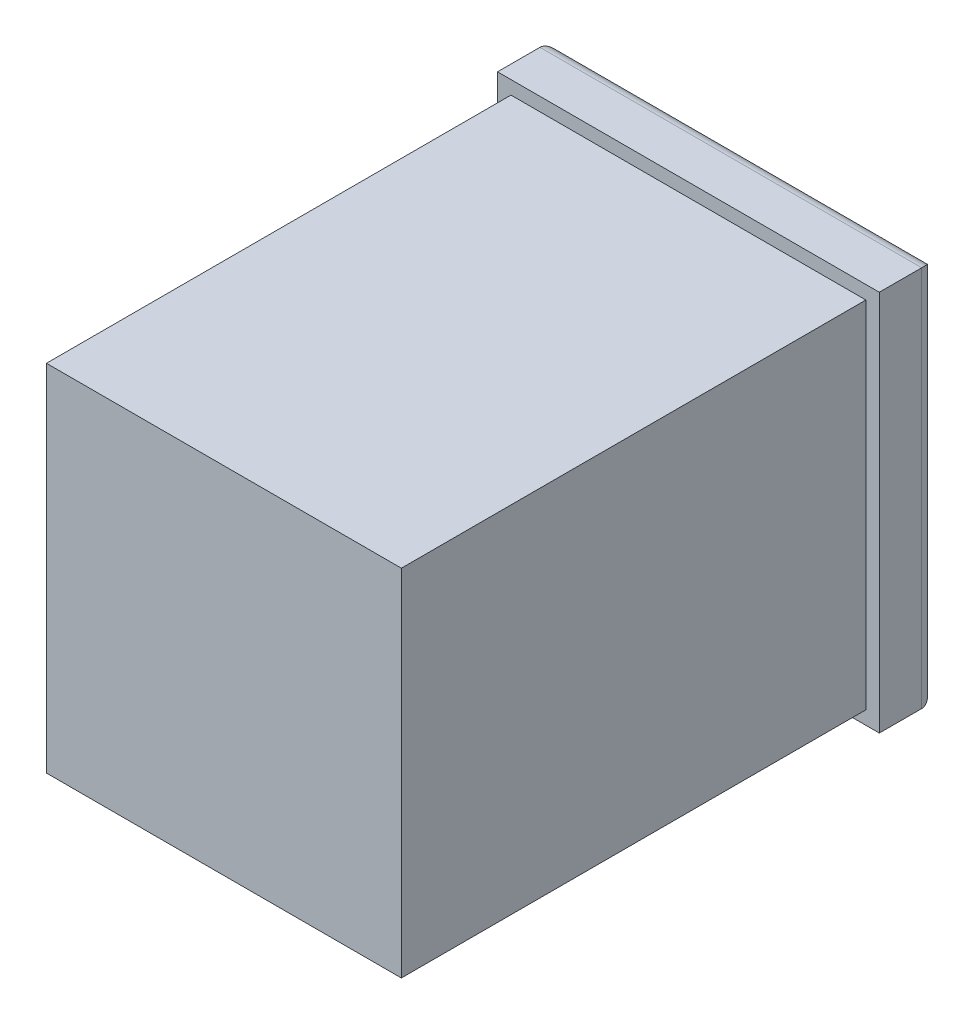
ISO-10303-21;
HEADER;
FILE_DESCRIPTION(('STEP AP214'),'2;1');
FILE_NAME('part.step','',(''),(''),'','','');
FILE_SCHEMA(('AUTOMOTIVE_DESIGN { 1 0 10303 214 1 1 1 1 }'));
ENDSEC;
DATA;
#1=APPLICATION_CONTEXT('core data for automotive mechanical design processes');
#2=APPLICATION_PROTOCOL_DEFINITION('international standard','automotive_design',2000,#1);
#3=PRODUCT_CONTEXT('',#1,'mechanical');
#4=PRODUCT('Part','Part','',(#3));
#5=PRODUCT_RELATED_PRODUCT_CATEGORY('part','',(#4));
#6=PRODUCT_DEFINITION_FORMATION('','',#4);
#7=PRODUCT_DEFINITION_CONTEXT('part definition',#1,'design');
#8=PRODUCT_DEFINITION('design','',#6,#7);
#9=PRODUCT_DEFINITION_SHAPE('','',#8);
#10=(LENGTH_UNIT() NAMED_UNIT(*) SI_UNIT(.MILLI.,.METRE.));
#11=(NAMED_UNIT(*) PLANE_ANGLE_UNIT() SI_UNIT($,.RADIAN.));
#12=(NAMED_UNIT(*) SI_UNIT($,.STERADIAN.) SOLID_ANGLE_UNIT());
#13=UNCERTAINTY_MEASURE_WITH_UNIT(LENGTH_MEASURE(1.E-05),#10,'distance_accuracy_value','');
#14=(GEOMETRIC_REPRESENTATION_CONTEXT(3) GLOBAL_UNCERTAINTY_ASSIGNED_CONTEXT((#13)) GLOBAL_UNIT_ASSIGNED_CONTEXT((#10,
#11,#12)) REPRESENTATION_CONTEXT('',''));
#15=CARTESIAN_POINT('',(0.,0.,0.));
#16=DIRECTION('',(0.,0.,1.));
#17=DIRECTION('',(1.,0.,0.));
#18=AXIS2_PLACEMENT_3D('',#15,#16,#17);
#19=CARTESIAN_POINT('',(12.55,-12.55,32.85));
#20=DIRECTION('',(-1.,0.,0.));
#21=DIRECTION('',(0.,0.,1.));
#22=AXIS2_PLACEMENT_3D('',#19,#20,#21);
#23=PLANE('',#22);
#24=DIRECTION('',(0.,1.,0.));
#25=VECTOR('',#24,1.);
#26=CARTESIAN_POINT('',(12.55,-12.55,0.));
#27=LINE('',#26,#25);
#28=CARTESIAN_POINT('',(12.55,-12.55,0.));
#29=VERTEX_POINT('',#28);
#30=CARTESIAN_POINT('',(12.55,12.55,0.));
#31=VERTEX_POINT('',#30);
#32=EDGE_CURVE('E253',#29,#31,#27,.T.);
#33=ORIENTED_EDGE('',*,*,#32,.T.);
#34=DIRECTION('',(0.,0.,-1.));
#35=VECTOR('',#34,1.);
#36=CARTESIAN_POINT('',(12.55,12.55,32.85));
#37=LINE('',#36,#35);
#38=CARTESIAN_POINT('',(12.55,12.55,32.85));
#39=VERTEX_POINT('',#38);
#40=EDGE_CURVE('E283',#39,#31,#37,.T.);
#41=ORIENTED_EDGE('',*,*,#40,.F.);
#42=DIRECTION('',(0.,1.,0.));
#43=VECTOR('',#42,1.);
#44=CARTESIAN_POINT('',(12.55,-12.55,32.85));
#45=LINE('',#44,#43);
#46=CARTESIAN_POINT('',(12.55,-12.55,32.85));
#47=VERTEX_POINT('',#46);
#48=EDGE_CURVE('E254',#47,#39,#45,.T.);
#49=ORIENTED_EDGE('',*,*,#48,.F.);
#50=DIRECTION('',(0.,0.,-1.));
#51=VECTOR('',#50,1.);
#52=CARTESIAN_POINT('',(12.55,-12.55,32.85));
#53=LINE('',#52,#51);
#54=EDGE_CURVE('E264',#47,#29,#53,.T.);
#55=ORIENTED_EDGE('',*,*,#54,.T.);
#56=EDGE_LOOP('',(#33,#41,#49,#55));
#57=FACE_BOUND('',#56,.T.);
#58=ADVANCED_FACE('F32',(#57),#23,.F.);
#59=CARTESIAN_POINT('',(-12.55,12.55,32.85));
#60=DIRECTION('',(0.,-1.,0.));
#61=DIRECTION('',(0.,0.,-1.));
#62=AXIS2_PLACEMENT_3D('',#59,#60,#61);
#63=PLANE('',#62);
#64=DIRECTION('',(-1.,0.,0.));
#65=VECTOR('',#64,1.);
#66=CARTESIAN_POINT('',(-12.55,12.55,0.));
#67=LINE('',#66,#65);
#68=CARTESIAN_POINT('',(-12.55,12.55,0.));
#69=VERTEX_POINT('',#68);
#70=EDGE_CURVE('E267',#31,#69,#67,.T.);
#71=ORIENTED_EDGE('',*,*,#70,.T.);
#72=DIRECTION('',(0.,0.,-1.));
#73=VECTOR('',#72,1.);
#74=CARTESIAN_POINT('',(-12.55,12.55,32.85));
#75=LINE('',#74,#73);
#76=CARTESIAN_POINT('',(-12.55,12.55,32.85));
#77=VERTEX_POINT('',#76);
#78=EDGE_CURVE('E280',#77,#69,#75,.T.);
#79=ORIENTED_EDGE('',*,*,#78,.F.);
#80=DIRECTION('',(-1.,0.,0.));
#81=VECTOR('',#80,1.);
#82=CARTESIAN_POINT('',(-12.55,12.55,32.85));
#83=LINE('',#82,#81);
#84=EDGE_CURVE('E257',#39,#77,#83,.T.);
#85=ORIENTED_EDGE('',*,*,#84,.F.);
#86=ORIENTED_EDGE('',*,*,#40,.T.);
#87=EDGE_LOOP('',(#71,#79,#85,#86));
#88=FACE_BOUND('',#87,.T.);
#89=ADVANCED_FACE('F358',(#88),#63,.F.);
#90=CARTESIAN_POINT('',(-12.55,-12.55,32.85));
#91=DIRECTION('',(1.,0.,0.));
#92=DIRECTION('',(0.,0.,-1.));
#93=AXIS2_PLACEMENT_3D('',#90,#91,#92);
#94=PLANE('',#93);
#95=DIRECTION('',(0.,-1.,0.));
#96=VECTOR('',#95,1.);
#97=CARTESIAN_POINT('',(-12.55,-12.55,0.));
#98=LINE('',#97,#96);
#99=CARTESIAN_POINT('',(-12.55,-12.55,0.));
#100=VERTEX_POINT('',#99);
#101=EDGE_CURVE('E270',#69,#100,#98,.T.);
#102=ORIENTED_EDGE('',*,*,#101,.T.);
#103=DIRECTION('',(0.,0.,-1.));
#104=VECTOR('',#103,1.);
#105=CARTESIAN_POINT('',(-12.55,-12.55,32.85));
#106=LINE('',#105,#104);
#107=CARTESIAN_POINT('',(-12.55,-12.55,32.85));
#108=VERTEX_POINT('',#107);
#109=EDGE_CURVE('E277',#108,#100,#106,.T.);
#110=ORIENTED_EDGE('',*,*,#109,.F.);
#111=DIRECTION('',(0.,-1.,0.));
#112=VECTOR('',#111,1.);
#113=CARTESIAN_POINT('',(-12.55,-12.55,32.85));
#114=LINE('',#113,#112);
#115=EDGE_CURVE('E260',#77,#108,#114,.T.);
#116=ORIENTED_EDGE('',*,*,#115,.F.);
#117=ORIENTED_EDGE('',*,*,#78,.T.);
#118=EDGE_LOOP('',(#102,#110,#116,#117));
#119=FACE_BOUND('',#118,.T.);
#120=ADVANCED_FACE('F364',(#119),#94,.F.);
#121=CARTESIAN_POINT('',(-12.55,-12.55,32.85));
#122=DIRECTION('',(0.,1.,0.));
#123=DIRECTION('',(0.,0.,1.));
#124=AXIS2_PLACEMENT_3D('',#121,#122,#123);
#125=PLANE('',#124);
#126=DIRECTION('',(1.,0.,0.));
#127=VECTOR('',#126,1.);
#128=CARTESIAN_POINT('',(-12.55,-12.55,0.));
#129=LINE('',#128,#127);
#130=EDGE_CURVE('E258',#100,#29,#129,.T.);
#131=ORIENTED_EDGE('',*,*,#130,.T.);
#132=ORIENTED_EDGE('',*,*,#54,.F.);
#133=DIRECTION('',(1.,0.,0.));
#134=VECTOR('',#133,1.);
#135=CARTESIAN_POINT('',(-12.55,-12.55,32.85));
#136=LINE('',#135,#134);
#137=EDGE_CURVE('E262',#108,#47,#136,.T.);
#138=ORIENTED_EDGE('',*,*,#137,.F.);
#139=ORIENTED_EDGE('',*,*,#109,.T.);
#140=EDGE_LOOP('',(#131,#132,#138,#139));
#141=FACE_BOUND('',#140,.T.);
#142=ADVANCED_FACE('F553',(#141),#125,.F.);
#143=CARTESIAN_POINT('',(0.,0.,32.85));
#144=DIRECTION('',(0.,0.,-1.));
#145=DIRECTION('',(-1.,0.,0.));
#146=AXIS2_PLACEMENT_3D('',#143,#144,#145);
#147=PLANE('',#146);
#148=ORIENTED_EDGE('',*,*,#48,.T.);
#149=ORIENTED_EDGE('',*,*,#84,.T.);
#150=ORIENTED_EDGE('',*,*,#115,.T.);
#151=ORIENTED_EDGE('',*,*,#137,.T.);
#152=EDGE_LOOP('',(#148,#149,#150,#151));
#153=FACE_BOUND('',#152,.T.);
#154=ADVANCED_FACE('F545',(#153),#147,.F.);
#155=CARTESIAN_POINT('',(0.,0.,0.));
#156=DIRECTION('',(0.,0.,1.));
#157=DIRECTION('',(1.,0.,0.));
#158=AXIS2_PLACEMENT_3D('',#155,#156,#157);
#159=PLANE('',#158);
#160=DIRECTION('',(0.,1.,0.));
#161=VECTOR('',#160,1.);
#162=CARTESIAN_POINT('',(-13.5,-13.5,0.));
#163=LINE('',#162,#161);
#164=CARTESIAN_POINT('',(-13.5,-13.5,0.));
#165=VERTEX_POINT('',#164);
#166=CARTESIAN_POINT('',(-13.5,13.5,0.));
#167=VERTEX_POINT('',#166);
#168=EDGE_CURVE('E233',#165,#167,#163,.T.);
#169=ORIENTED_EDGE('',*,*,#168,.F.);
#170=DIRECTION('',(-1.,0.,0.));
#171=VECTOR('',#170,1.);
#172=CARTESIAN_POINT('',(13.5,-13.5,0.));
#173=LINE('',#172,#171);
#174=CARTESIAN_POINT('',(13.5,-13.5,0.));
#175=VERTEX_POINT('',#174);
#176=EDGE_CURVE('E242',#175,#165,#173,.T.);
#177=ORIENTED_EDGE('',*,*,#176,.F.);
#178=DIRECTION('',(0.,-1.,0.));
#179=VECTOR('',#178,1.);
#180=CARTESIAN_POINT('',(13.5,-13.5,0.));
#181=LINE('',#180,#179);
#182=CARTESIAN_POINT('',(13.5,13.5,0.));
#183=VERTEX_POINT('',#182);
#184=EDGE_CURVE('E239',#183,#175,#181,.T.);
#185=ORIENTED_EDGE('',*,*,#184,.F.);
#186=DIRECTION('',(1.,0.,0.));
#187=VECTOR('',#186,1.);
#188=CARTESIAN_POINT('',(13.5,13.5,0.));
#189=LINE('',#188,#187);
#190=EDGE_CURVE('E236',#167,#183,#189,.T.);
#191=ORIENTED_EDGE('',*,*,#190,.F.);
#192=EDGE_LOOP('',(#169,#177,#185,#191));
#193=FACE_BOUND('',#192,.T.);
#194=ORIENTED_EDGE('',*,*,#32,.F.);
#195=ORIENTED_EDGE('',*,*,#130,.F.);
#196=ORIENTED_EDGE('',*,*,#101,.F.);
#197=ORIENTED_EDGE('',*,*,#70,.F.);
#198=EDGE_LOOP('',(#194,#195,#196,#197));
#199=FACE_BOUND('',#198,.T.);
#200=ADVANCED_FACE('F330',(#193,#199),#159,.T.);
#201=CARTESIAN_POINT('',(-13.5,-13.5,-4.));
#202=DIRECTION('',(1.,0.,0.));
#203=DIRECTION('',(0.,0.,-1.));
#204=AXIS2_PLACEMENT_3D('',#201,#202,#203);
#205=PLANE('',#204);
#206=DIRECTION('',(0.,0.,1.));
#207=VECTOR('',#206,1.);
#208=CARTESIAN_POINT('',(-13.5,13.5,-4.));
#209=LINE('',#208,#207);
#210=CARTESIAN_POINT('',(-13.5,13.5,-3.));
#211=VERTEX_POINT('',#210);
#212=EDGE_CURVE('E251',#211,#167,#209,.T.);
#213=ORIENTED_EDGE('',*,*,#212,.F.);
#214=DIRECTION('',(0.,1.,0.));
#215=VECTOR('',#214,1.);
#216=CARTESIAN_POINT('',(-13.5,-13.5,-3.));
#217=LINE('',#216,#215);
#218=CARTESIAN_POINT('',(-13.5,-13.5,-3.));
#219=VERTEX_POINT('',#218);
#220=EDGE_CURVE('E298',#211,#219,#217,.F.);
#221=ORIENTED_EDGE('',*,*,#220,.T.);
#222=DIRECTION('',(0.,0.,1.));
#223=VECTOR('',#222,1.);
#224=CARTESIAN_POINT('',(-13.5,-13.5,-4.));
#225=LINE('',#224,#223);
#226=EDGE_CURVE('E245',#219,#165,#225,.T.);
#227=ORIENTED_EDGE('',*,*,#226,.T.);
#228=ORIENTED_EDGE('',*,*,#168,.T.);
#229=EDGE_LOOP('',(#213,#221,#227,#228));
#230=FACE_BOUND('',#229,.T.);
#231=ADVANCED_FACE('F325',(#230),#205,.F.);
#232=CARTESIAN_POINT('',(13.5,13.5,-4.));
#233=DIRECTION('',(0.,-1.,0.));
#234=DIRECTION('',(0.,0.,-1.));
#235=AXIS2_PLACEMENT_3D('',#232,#233,#234);
#236=PLANE('',#235);
#237=DIRECTION('',(0.,0.,1.));
#238=VECTOR('',#237,1.);
#239=CARTESIAN_POINT('',(13.5,13.5,-4.));
#240=LINE('',#239,#238);
#241=CARTESIAN_POINT('',(13.5,13.5,-3.));
#242=VERTEX_POINT('',#241);
#243=EDGE_CURVE('E249',#242,#183,#240,.T.);
#244=ORIENTED_EDGE('',*,*,#243,.F.);
#245=DIRECTION('',(1.,0.,0.));
#246=VECTOR('',#245,1.);
#247=CARTESIAN_POINT('',(13.5,13.5,-3.));
#248=LINE('',#247,#246);
#249=EDGE_CURVE('E11',#242,#211,#248,.F.);
#250=ORIENTED_EDGE('',*,*,#249,.T.);
#251=ORIENTED_EDGE('',*,*,#212,.T.);
#252=ORIENTED_EDGE('',*,*,#190,.T.);
#253=EDGE_LOOP('',(#244,#250,#251,#252));
#254=FACE_BOUND('',#253,.T.);
#255=ADVANCED_FACE('F322',(#254),#236,.F.);
#256=CARTESIAN_POINT('',(13.5,-13.5,-4.));
#257=DIRECTION('',(-1.,0.,0.));
#258=DIRECTION('',(0.,0.,1.));
#259=AXIS2_PLACEMENT_3D('',#256,#257,#258);
#260=PLANE('',#259);
#261=DIRECTION('',(0.,0.,1.));
#262=VECTOR('',#261,1.);
#263=CARTESIAN_POINT('',(13.5,-13.5,-4.));
#264=LINE('',#263,#262);
#265=CARTESIAN_POINT('',(13.5,-13.5,-3.));
#266=VERTEX_POINT('',#265);
#267=EDGE_CURVE('E247',#266,#175,#264,.T.);
#268=ORIENTED_EDGE('',*,*,#267,.F.);
#269=DIRECTION('',(0.,-1.,0.));
#270=VECTOR('',#269,1.);
#271=CARTESIAN_POINT('',(13.5,-13.5,-3.));
#272=LINE('',#271,#270);
#273=EDGE_CURVE('E41',#266,#242,#272,.F.);
#274=ORIENTED_EDGE('',*,*,#273,.T.);
#275=ORIENTED_EDGE('',*,*,#243,.T.);
#276=ORIENTED_EDGE('',*,*,#184,.T.);
#277=EDGE_LOOP('',(#268,#274,#275,#276));
#278=FACE_BOUND('',#277,.T.);
#279=ADVANCED_FACE('F335',(#278),#260,.F.);
#280=CARTESIAN_POINT('',(13.5,-13.5,-4.));
#281=DIRECTION('',(0.,1.,0.));
#282=DIRECTION('',(0.,0.,1.));
#283=AXIS2_PLACEMENT_3D('',#280,#281,#282);
#284=PLANE('',#283);
#285=ORIENTED_EDGE('',*,*,#226,.F.);
#286=DIRECTION('',(-1.,0.,0.));
#287=VECTOR('',#286,1.);
#288=CARTESIAN_POINT('',(13.5,-13.5,-3.));
#289=LINE('',#288,#287);
#290=EDGE_CURVE('E295',#219,#266,#289,.F.);
#291=ORIENTED_EDGE('',*,*,#290,.T.);
#292=ORIENTED_EDGE('',*,*,#267,.T.);
#293=ORIENTED_EDGE('',*,*,#176,.T.);
#294=EDGE_LOOP('',(#285,#291,#292,#293));
#295=FACE_BOUND('',#294,.T.);
#296=ADVANCED_FACE('F337',(#295),#284,.F.);
#297=CARTESIAN_POINT('',(0.,0.,-4.));
#298=DIRECTION('',(0.,0.,1.));
#299=DIRECTION('',(1.,0.,0.));
#300=AXIS2_PLACEMENT_3D('',#297,#298,#299);
#301=PLANE('',#300);
#302=DIRECTION('',(1.,0.,0.));
#303=VECTOR('',#302,1.);
#304=CARTESIAN_POINT('',(7.5,9.5,-4.));
#305=LINE('',#304,#303);
#306=CARTESIAN_POINT('',(6.19032744072712,9.5,-4.));
#307=VERTEX_POINT('',#306);
#308=CARTESIAN_POINT('',(7.5,9.5,-4.));
#309=VERTEX_POINT('',#308);
#310=EDGE_CURVE('E187',#307,#309,#305,.T.);
#311=ORIENTED_EDGE('',*,*,#310,.F.);
#312=DIRECTION('',(0.,1.,0.));
#313=VECTOR('',#312,1.);
#314=CARTESIAN_POINT('',(6.19032744072712,9.5,-4.));
#315=LINE('',#314,#313);
#316=CARTESIAN_POINT('',(6.19032744072712,1.95655324390032,-4.));
#317=VERTEX_POINT('',#316);
#318=EDGE_CURVE('E49',#317,#307,#315,.T.);
#319=ORIENTED_EDGE('',*,*,#318,.F.);
#320=DIRECTION('',(-1.,0.,0.));
#321=VECTOR('',#320,1.);
#322=CARTESIAN_POINT('',(7.5,1.95655324390032,-4.));
#323=LINE('',#322,#321);
#324=CARTESIAN_POINT('',(7.5,1.95655324390032,-4.));
#325=VERTEX_POINT('',#324);
#326=EDGE_CURVE('E178',#325,#317,#323,.T.);
#327=ORIENTED_EDGE('',*,*,#326,.F.);
#328=DIRECTION('',(0.,-1.,0.));
#329=VECTOR('',#328,1.);
#330=CARTESIAN_POINT('',(7.5,9.5,-4.));
#331=LINE('',#330,#329);
#332=EDGE_CURVE('E181',#309,#325,#331,.T.);
#333=ORIENTED_EDGE('',*,*,#332,.F.);
#334=EDGE_LOOP('',(#311,#319,#327,#333));
#335=FACE_BOUND('',#334,.T.);
#336=DIRECTION('',(1.,0.,0.));
#337=VECTOR('',#336,1.);
#338=CARTESIAN_POINT('',(-7.5,9.5,-4.));
#339=LINE('',#338,#337);
#340=CARTESIAN_POINT('',(-7.5,9.5,-4.));
#341=VERTEX_POINT('',#340);
#342=CARTESIAN_POINT('',(-6.47615449164007,9.5,-4.));
#343=VERTEX_POINT('',#342);
#344=EDGE_CURVE('E213',#341,#343,#339,.T.);
#345=ORIENTED_EDGE('',*,*,#344,.F.);
#346=DIRECTION('',(0.,1.,0.));
#347=VECTOR('',#346,1.);
#348=CARTESIAN_POINT('',(-7.5,9.5,-4.));
#349=LINE('',#348,#347);
#350=CARTESIAN_POINT('',(-7.5,2.31360947977066,-4.));
#351=VERTEX_POINT('',#350);
#352=EDGE_CURVE('E57',#351,#341,#349,.T.);
#353=ORIENTED_EDGE('',*,*,#352,.F.);
#354=DIRECTION('',(-1.,0.,0.));
#355=VECTOR('',#354,1.);
#356=CARTESIAN_POINT('',(-7.5,2.31360947977066,-4.));
#357=LINE('',#356,#355);
#358=CARTESIAN_POINT('',(-6.47615449164007,2.31360947977066,-4.));
#359=VERTEX_POINT('',#358);
#360=EDGE_CURVE('E202',#359,#351,#357,.T.);
#361=ORIENTED_EDGE('',*,*,#360,.F.);
#362=DIRECTION('',(0.,-1.,0.));
#363=VECTOR('',#362,1.);
#364=CARTESIAN_POINT('',(-6.47615449164007,9.5,-4.));
#365=LINE('',#364,#363);
#366=EDGE_CURVE('E217',#343,#359,#365,.T.);
#367=ORIENTED_EDGE('',*,*,#366,.F.);
#368=EDGE_LOOP('',(#345,#353,#361,#367));
#369=FACE_BOUND('',#368,.T.);
#370=CARTESIAN_POINT('',(0.,-5.37095658505393,-4.));
#371=DIRECTION('',(0.,0.,-1.));
#372=DIRECTION('',(-1.,0.,0.));
#373=AXIS2_PLACEMENT_3D('',#370,#371,#372);
#374=CIRCLE('',#373,1.41583188084221);
#375=CARTESIAN_POINT('',(-1.41583188084221,-5.37095658505393,-4.));
#376=VERTEX_POINT('',#375);
#377=EDGE_CURVE('E230',#376,#376,#374,.T.);
#378=ORIENTED_EDGE('',*,*,#377,.F.);
#379=EDGE_LOOP('',(#378));
#380=FACE_BOUND('',#379,.T.);
#381=DIRECTION('',(0.,-1.,0.));
#382=VECTOR('',#381,1.);
#383=CARTESIAN_POINT('',(12.5,0.,-4.));
#384=LINE('',#383,#382);
#385=CARTESIAN_POINT('',(12.5,12.5,-4.));
#386=VERTEX_POINT('',#385);
#387=CARTESIAN_POINT('',(12.5,-12.5,-4.));
#388=VERTEX_POINT('',#387);
#389=EDGE_CURVE('E288',#386,#388,#384,.T.);
#390=ORIENTED_EDGE('',*,*,#389,.T.);
#391=DIRECTION('',(-1.,0.,0.));
#392=VECTOR('',#391,1.);
#393=CARTESIAN_POINT('',(0.,-12.5,-4.));
#394=LINE('',#393,#392);
#395=CARTESIAN_POINT('',(-12.5,-12.5,-4.));
#396=VERTEX_POINT('',#395);
#397=EDGE_CURVE('E292',#388,#396,#394,.T.);
#398=ORIENTED_EDGE('',*,*,#397,.T.);
#399=DIRECTION('',(0.,1.,0.));
#400=VECTOR('',#399,1.);
#401=CARTESIAN_POINT('',(-12.5,0.,-4.));
#402=LINE('',#401,#400);
#403=CARTESIAN_POINT('',(-12.5,12.5,-4.));
#404=VERTEX_POINT('',#403);
#405=EDGE_CURVE('E290',#396,#404,#402,.T.);
#406=ORIENTED_EDGE('',*,*,#405,.T.);
#407=DIRECTION('',(1.,0.,0.));
#408=VECTOR('',#407,1.);
#409=CARTESIAN_POINT('',(0.,12.5,-4.));
#410=LINE('',#409,#408);
#411=EDGE_CURVE('E286',#404,#386,#410,.T.);
#412=ORIENTED_EDGE('',*,*,#411,.T.);
#413=EDGE_LOOP('',(#390,#398,#406,#412));
#414=FACE_BOUND('',#413,.T.);
#415=ADVANCED_FACE('F345',(#335,#369,#380,#414),#301,.F.);
#416=CARTESIAN_POINT('',(0.,12.5,-3.));
#417=DIRECTION('',(1.,0.,0.));
#418=DIRECTION('',(0.,0.,-1.));
#419=AXIS2_PLACEMENT_3D('',#416,#417,#418);
#420=CYLINDRICAL_SURFACE('',#419,1.);
#421=CARTESIAN_POINT('',(-12.5,12.5,-3.));
#422=DIRECTION('',(0.707106781186547,0.707106781186547,0.));
#423=DIRECTION('',(0.707106781186547,-0.707106781186547,0.));
#424=AXIS2_PLACEMENT_3D('',#421,#422,#423);
#425=ELLIPSE('',#424,1.41421356237309,1.);
#426=EDGE_CURVE('E303',#211,#404,#425,.F.);
#427=ORIENTED_EDGE('',*,*,#426,.F.);
#428=ORIENTED_EDGE('',*,*,#249,.F.);
#429=CARTESIAN_POINT('',(12.5,12.5,-3.));
#430=DIRECTION('',(0.707106781186547,-0.707106781186547,0.));
#431=DIRECTION('',(0.707106781186547,0.707106781186547,0.));
#432=AXIS2_PLACEMENT_3D('',#429,#430,#431);
#433=ELLIPSE('',#432,1.41421356237309,1.);
#434=EDGE_CURVE('E36',#386,#242,#433,.T.);
#435=ORIENTED_EDGE('',*,*,#434,.F.);
#436=ORIENTED_EDGE('',*,*,#411,.F.);
#437=EDGE_LOOP('',(#427,#428,#435,#436));
#438=FACE_BOUND('',#437,.T.);
#439=ADVANCED_FACE('F34',(#438),#420,.T.);
#440=CARTESIAN_POINT('',(12.5,0.,-3.));
#441=DIRECTION('',(0.,-1.,0.));
#442=DIRECTION('',(0.,0.,-1.));
#443=AXIS2_PLACEMENT_3D('',#440,#441,#442);
#444=CYLINDRICAL_SURFACE('',#443,1.);
#445=ORIENTED_EDGE('',*,*,#434,.T.);
#446=ORIENTED_EDGE('',*,*,#273,.F.);
#447=CARTESIAN_POINT('',(12.5,-12.5,-3.));
#448=DIRECTION('',(-0.707106781186547,-0.707106781186547,0.));
#449=DIRECTION('',(0.707106781186547,-0.707106781186547,0.));
#450=AXIS2_PLACEMENT_3D('',#447,#448,#449);
#451=ELLIPSE('',#450,1.41421356237309,1.);
#452=EDGE_CURVE('E302',#388,#266,#451,.T.);
#453=ORIENTED_EDGE('',*,*,#452,.F.);
#454=ORIENTED_EDGE('',*,*,#389,.F.);
#455=EDGE_LOOP('',(#445,#446,#453,#454));
#456=FACE_BOUND('',#455,.T.);
#457=ADVANCED_FACE('F314',(#456),#444,.T.);
#458=CARTESIAN_POINT('',(-12.5,0.,-3.));
#459=DIRECTION('',(0.,1.,0.));
#460=DIRECTION('',(0.,0.,1.));
#461=AXIS2_PLACEMENT_3D('',#458,#459,#460);
#462=CYLINDRICAL_SURFACE('',#461,1.);
#463=ORIENTED_EDGE('',*,*,#426,.T.);
#464=ORIENTED_EDGE('',*,*,#405,.F.);
#465=CARTESIAN_POINT('',(-12.5,-12.5,-3.));
#466=DIRECTION('',(-0.707106781186547,0.707106781186547,0.));
#467=DIRECTION('',(0.707106781186547,0.707106781186547,0.));
#468=AXIS2_PLACEMENT_3D('',#465,#466,#467);
#469=ELLIPSE('',#468,1.41421356237309,1.);
#470=EDGE_CURVE('E194',#219,#396,#469,.F.);
#471=ORIENTED_EDGE('',*,*,#470,.F.);
#472=ORIENTED_EDGE('',*,*,#220,.F.);
#473=EDGE_LOOP('',(#463,#464,#471,#472));
#474=FACE_BOUND('',#473,.T.);
#475=ADVANCED_FACE('F343',(#474),#462,.T.);
#476=CARTESIAN_POINT('',(0.,-12.5,-3.));
#477=DIRECTION('',(-1.,0.,0.));
#478=DIRECTION('',(0.,0.,1.));
#479=AXIS2_PLACEMENT_3D('',#476,#477,#478);
#480=CYLINDRICAL_SURFACE('',#479,1.);
#481=ORIENTED_EDGE('',*,*,#452,.T.);
#482=ORIENTED_EDGE('',*,*,#290,.F.);
#483=ORIENTED_EDGE('',*,*,#470,.T.);
#484=ORIENTED_EDGE('',*,*,#397,.F.);
#485=EDGE_LOOP('',(#481,#482,#483,#484));
#486=FACE_BOUND('',#485,.T.);
#487=ADVANCED_FACE('F341',(#486),#480,.T.);
#488=CARTESIAN_POINT('',(0.,-5.37095658505393,20.));
#489=DIRECTION('',(0.,0.,-1.));
#490=DIRECTION('',(-1.,0.,0.));
#491=AXIS2_PLACEMENT_3D('',#488,#489,#490);
#492=CYLINDRICAL_SURFACE('',#491,1.41583188084221);
#493=CARTESIAN_POINT('',(0.,-5.37095658505393,20.));
#494=DIRECTION('',(0.,0.,-1.));
#495=DIRECTION('',(-1.,0.,0.));
#496=AXIS2_PLACEMENT_3D('',#493,#494,#495);
#497=CIRCLE('',#496,1.41583188084221);
#498=CARTESIAN_POINT('',(-1.41583188084221,-5.37095658505393,20.));
#499=VERTEX_POINT('',#498);
#500=EDGE_CURVE('E214',#499,#499,#497,.T.);
#501=ORIENTED_EDGE('',*,*,#500,.F.);
#502=EDGE_LOOP('',(#501));
#503=FACE_BOUND('',#502,.T.);
#504=ORIENTED_EDGE('',*,*,#377,.T.);
#505=EDGE_LOOP('',(#504));
#506=FACE_BOUND('',#505,.T.);
#507=ADVANCED_FACE('F371',(#503,#506),#492,.F.);
#508=CARTESIAN_POINT('',(0.,-5.37095658505393,20.));
#509=DIRECTION('',(0.,0.,-1.));
#510=DIRECTION('',(-1.,0.,0.));
#511=AXIS2_PLACEMENT_3D('',#508,#509,#510);
#512=PLANE('',#511);
#513=ORIENTED_EDGE('',*,*,#500,.T.);
#514=EDGE_LOOP('',(#513));
#515=FACE_BOUND('',#514,.T.);
#516=ADVANCED_FACE('F392',(#515),#512,.T.);
#517=CARTESIAN_POINT('',(-7.5,9.5,20.));
#518=DIRECTION('',(-1.,0.,0.));
#519=DIRECTION('',(0.,0.,1.));
#520=AXIS2_PLACEMENT_3D('',#517,#518,#519);
#521=PLANE('',#520);
#522=ORIENTED_EDGE('',*,*,#352,.T.);
#523=DIRECTION('',(0.,0.,-1.));
#524=VECTOR('',#523,1.);
#525=CARTESIAN_POINT('',(-7.5,9.5,20.));
#526=LINE('',#525,#524);
#527=CARTESIAN_POINT('',(-7.5,9.5,20.));
#528=VERTEX_POINT('',#527);
#529=EDGE_CURVE('E211',#528,#341,#526,.T.);
#530=ORIENTED_EDGE('',*,*,#529,.F.);
#531=DIRECTION('',(0.,1.,0.));
#532=VECTOR('',#531,1.);
#533=CARTESIAN_POINT('',(-7.5,9.5,20.));
#534=LINE('',#533,#532);
#535=CARTESIAN_POINT('',(-7.5,2.31360947977066,20.));
#536=VERTEX_POINT('',#535);
#537=EDGE_CURVE('E198',#536,#528,#534,.T.);
#538=ORIENTED_EDGE('',*,*,#537,.F.);
#539=DIRECTION('',(0.,0.,-1.));
#540=VECTOR('',#539,1.);
#541=CARTESIAN_POINT('',(-7.5,2.31360947977066,20.));
#542=LINE('',#541,#540);
#543=EDGE_CURVE('E188',#536,#351,#542,.T.);
#544=ORIENTED_EDGE('',*,*,#543,.T.);
#545=EDGE_LOOP('',(#522,#530,#538,#544));
#546=FACE_BOUND('',#545,.T.);
#547=ADVANCED_FACE('F399',(#546),#521,.F.);
#548=CARTESIAN_POINT('',(-7.5,2.31360947977066,20.));
#549=DIRECTION('',(0.,-1.,0.));
#550=DIRECTION('',(0.,0.,-1.));
#551=AXIS2_PLACEMENT_3D('',#548,#549,#550);
#552=PLANE('',#551);
#553=ORIENTED_EDGE('',*,*,#360,.T.);
#554=ORIENTED_EDGE('',*,*,#543,.F.);
#555=DIRECTION('',(-1.,0.,0.));
#556=VECTOR('',#555,1.);
#557=CARTESIAN_POINT('',(-7.5,2.31360947977066,20.));
#558=LINE('',#557,#556);
#559=CARTESIAN_POINT('',(-6.47615449164007,2.31360947977066,20.));
#560=VERTEX_POINT('',#559);
#561=EDGE_CURVE('E208',#560,#536,#558,.T.);
#562=ORIENTED_EDGE('',*,*,#561,.F.);
#563=DIRECTION('',(0.,0.,-1.));
#564=VECTOR('',#563,1.);
#565=CARTESIAN_POINT('',(-6.47615449164007,2.31360947977066,20.));
#566=LINE('',#565,#564);
#567=EDGE_CURVE('E223',#560,#359,#566,.T.);
#568=ORIENTED_EDGE('',*,*,#567,.T.);
#569=EDGE_LOOP('',(#553,#554,#562,#568));
#570=FACE_BOUND('',#569,.T.);
#571=ADVANCED_FACE('F407',(#570),#552,.F.);
#572=CARTESIAN_POINT('',(-6.47615449164007,9.5,20.));
#573=DIRECTION('',(1.,0.,0.));
#574=DIRECTION('',(0.,0.,-1.));
#575=AXIS2_PLACEMENT_3D('',#572,#573,#574);
#576=PLANE('',#575);
#577=ORIENTED_EDGE('',*,*,#366,.T.);
#578=ORIENTED_EDGE('',*,*,#567,.F.);
#579=DIRECTION('',(0.,-1.,0.));
#580=VECTOR('',#579,1.);
#581=CARTESIAN_POINT('',(-6.47615449164007,9.5,20.));
#582=LINE('',#581,#580);
#583=CARTESIAN_POINT('',(-6.47615449164007,9.5,20.));
#584=VERTEX_POINT('',#583);
#585=EDGE_CURVE('E205',#584,#560,#582,.T.);
#586=ORIENTED_EDGE('',*,*,#585,.F.);
#587=DIRECTION('',(0.,0.,-1.));
#588=VECTOR('',#587,1.);
#589=CARTESIAN_POINT('',(-6.47615449164007,9.5,20.));
#590=LINE('',#589,#588);
#591=EDGE_CURVE('E225',#584,#343,#590,.T.);
#592=ORIENTED_EDGE('',*,*,#591,.T.);
#593=EDGE_LOOP('',(#577,#578,#586,#592));
#594=FACE_BOUND('',#593,.T.);
#595=ADVANCED_FACE('F414',(#594),#576,.F.);
#596=CARTESIAN_POINT('',(-7.5,9.5,20.));
#597=DIRECTION('',(0.,1.,0.));
#598=DIRECTION('',(0.,0.,1.));
#599=AXIS2_PLACEMENT_3D('',#596,#597,#598);
#600=PLANE('',#599);
#601=ORIENTED_EDGE('',*,*,#344,.T.);
#602=ORIENTED_EDGE('',*,*,#591,.F.);
#603=DIRECTION('',(1.,0.,0.));
#604=VECTOR('',#603,1.);
#605=CARTESIAN_POINT('',(-7.5,9.5,20.));
#606=LINE('',#605,#604);
#607=EDGE_CURVE('E201',#528,#584,#606,.T.);
#608=ORIENTED_EDGE('',*,*,#607,.F.);
#609=ORIENTED_EDGE('',*,*,#529,.T.);
#610=EDGE_LOOP('',(#601,#602,#608,#609));
#611=FACE_BOUND('',#610,.T.);
#612=ADVANCED_FACE('F422',(#611),#600,.F.);
#613=CARTESIAN_POINT('',(0.,0.,20.));
#614=DIRECTION('',(0.,0.,1.));
#615=DIRECTION('',(1.,0.,0.));
#616=AXIS2_PLACEMENT_3D('',#613,#614,#615);
#617=PLANE('',#616);
#618=ORIENTED_EDGE('',*,*,#537,.T.);
#619=ORIENTED_EDGE('',*,*,#607,.T.);
#620=ORIENTED_EDGE('',*,*,#585,.T.);
#621=ORIENTED_EDGE('',*,*,#561,.T.);
#622=EDGE_LOOP('',(#618,#619,#620,#621));
#623=FACE_BOUND('',#622,.T.);
#624=ADVANCED_FACE('F430',(#623),#617,.F.);
#625=CARTESIAN_POINT('',(6.19032744072712,9.5,20.));
#626=DIRECTION('',(-1.,0.,0.));
#627=DIRECTION('',(0.,0.,1.));
#628=AXIS2_PLACEMENT_3D('',#625,#626,#627);
#629=PLANE('',#628);
#630=ORIENTED_EDGE('',*,*,#318,.T.);
#631=DIRECTION('',(0.,0.,-1.));
#632=VECTOR('',#631,1.);
#633=CARTESIAN_POINT('',(6.19032744072712,9.5,20.));
#634=LINE('',#633,#632);
#635=CARTESIAN_POINT('',(6.19032744072712,9.5,20.));
#636=VERTEX_POINT('',#635);
#637=EDGE_CURVE('E156',#636,#307,#634,.T.);
#638=ORIENTED_EDGE('',*,*,#637,.F.);
#639=DIRECTION('',(0.,1.,0.));
#640=VECTOR('',#639,1.);
#641=CARTESIAN_POINT('',(6.19032744072712,9.5,20.));
#642=LINE('',#641,#640);
#643=CARTESIAN_POINT('',(6.19032744072712,1.95655324390032,20.));
#644=VERTEX_POINT('',#643);
#645=EDGE_CURVE('E160',#644,#636,#642,.T.);
#646=ORIENTED_EDGE('',*,*,#645,.F.);
#647=DIRECTION('',(0.,0.,-1.));
#648=VECTOR('',#647,1.);
#649=CARTESIAN_POINT('',(6.19032744072712,1.95655324390032,20.));
#650=LINE('',#649,#648);
#651=EDGE_CURVE('E192',#644,#317,#650,.T.);
#652=ORIENTED_EDGE('',*,*,#651,.T.);
#653=EDGE_LOOP('',(#630,#638,#646,#652));
#654=FACE_BOUND('',#653,.T.);
#655=ADVANCED_FACE('F158',(#654),#629,.F.);
#656=CARTESIAN_POINT('',(7.5,1.95655324390032,20.));
#657=DIRECTION('',(0.,-1.,0.));
#658=DIRECTION('',(0.,0.,-1.));
#659=AXIS2_PLACEMENT_3D('',#656,#657,#658);
#660=PLANE('',#659);
#661=ORIENTED_EDGE('',*,*,#326,.T.);
#662=ORIENTED_EDGE('',*,*,#651,.F.);
#663=DIRECTION('',(-1.,0.,0.));
#664=VECTOR('',#663,1.);
#665=CARTESIAN_POINT('',(7.5,1.95655324390032,20.));
#666=LINE('',#665,#664);
#667=CARTESIAN_POINT('',(7.5,1.95655324390032,20.));
#668=VERTEX_POINT('',#667);
#669=EDGE_CURVE('E166',#668,#644,#666,.T.);
#670=ORIENTED_EDGE('',*,*,#669,.F.);
#671=DIRECTION('',(0.,0.,-1.));
#672=VECTOR('',#671,1.);
#673=CARTESIAN_POINT('',(7.5,1.95655324390032,20.));
#674=LINE('',#673,#672);
#675=EDGE_CURVE('E195',#668,#325,#674,.T.);
#676=ORIENTED_EDGE('',*,*,#675,.T.);
#677=EDGE_LOOP('',(#661,#662,#670,#676));
#678=FACE_BOUND('',#677,.T.);
#679=ADVANCED_FACE('F445',(#678),#660,.F.);
#680=CARTESIAN_POINT('',(7.5,9.5,20.));
#681=DIRECTION('',(1.,0.,0.));
#682=DIRECTION('',(0.,0.,-1.));
#683=AXIS2_PLACEMENT_3D('',#680,#681,#682);
#684=PLANE('',#683);
#685=ORIENTED_EDGE('',*,*,#332,.T.);
#686=ORIENTED_EDGE('',*,*,#675,.F.);
#687=DIRECTION('',(0.,-1.,0.));
#688=VECTOR('',#687,1.);
#689=CARTESIAN_POINT('',(7.5,9.5,20.));
#690=LINE('',#689,#688);
#691=CARTESIAN_POINT('',(7.5,9.5,20.));
#692=VERTEX_POINT('',#691);
#693=EDGE_CURVE('E174',#692,#668,#690,.T.);
#694=ORIENTED_EDGE('',*,*,#693,.F.);
#695=DIRECTION('',(0.,0.,-1.));
#696=VECTOR('',#695,1.);
#697=CARTESIAN_POINT('',(7.5,9.5,20.));
#698=LINE('',#697,#696);
#699=EDGE_CURVE('E165',#692,#309,#698,.T.);
#700=ORIENTED_EDGE('',*,*,#699,.T.);
#701=EDGE_LOOP('',(#685,#686,#694,#700));
#702=FACE_BOUND('',#701,.T.);
#703=ADVANCED_FACE('F452',(#702),#684,.F.);
#704=CARTESIAN_POINT('',(7.5,9.5,20.));
#705=DIRECTION('',(0.,1.,0.));
#706=DIRECTION('',(0.,0.,1.));
#707=AXIS2_PLACEMENT_3D('',#704,#705,#706);
#708=PLANE('',#707);
#709=ORIENTED_EDGE('',*,*,#310,.T.);
#710=ORIENTED_EDGE('',*,*,#699,.F.);
#711=DIRECTION('',(1.,0.,0.));
#712=VECTOR('',#711,1.);
#713=CARTESIAN_POINT('',(7.5,9.5,20.));
#714=LINE('',#713,#712);
#715=EDGE_CURVE('E169',#636,#692,#714,.T.);
#716=ORIENTED_EDGE('',*,*,#715,.F.);
#717=ORIENTED_EDGE('',*,*,#637,.T.);
#718=EDGE_LOOP('',(#709,#710,#716,#717));
#719=FACE_BOUND('',#718,.T.);
#720=ADVANCED_FACE('F170',(#719),#708,.F.);
#721=CARTESIAN_POINT('',(0.,0.,20.));
#722=DIRECTION('',(0.,0.,-1.));
#723=DIRECTION('',(-1.,0.,0.));
#724=AXIS2_PLACEMENT_3D('',#721,#722,#723);
#725=PLANE('',#724);
#726=ORIENTED_EDGE('',*,*,#645,.T.);
#727=ORIENTED_EDGE('',*,*,#715,.T.);
#728=ORIENTED_EDGE('',*,*,#693,.T.);
#729=ORIENTED_EDGE('',*,*,#669,.T.);
#730=EDGE_LOOP('',(#726,#727,#728,#729));
#731=FACE_BOUND('',#730,.T.);
#732=ADVANCED_FACE('F176',(#731),#725,.T.);
#733=CLOSED_SHELL('',(#58,#89,#120,#142,#154,#200,#231,#255,#279,#296,#415,#439,#457,#475,#487,
#507,#516,#547,#571,#595,#612,#624,#655,#679,#703,#720,#732));
#734=MANIFOLD_SOLID_BREP('B2',#733);
#735=ADVANCED_BREP_SHAPE_REPRESENTATION('',(#18,#734),#14);
#736=SHAPE_DEFINITION_REPRESENTATION(#9,#735);
ENDSEC;
END-ISO-10303-21;
